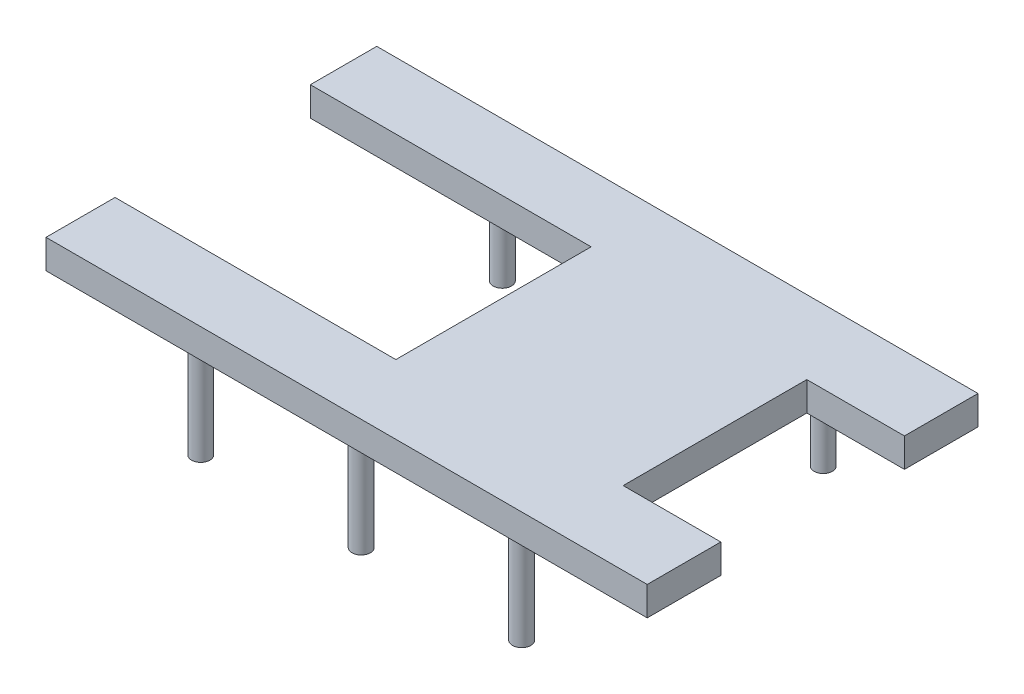
ISO-10303-21;
HEADER;
FILE_DESCRIPTION(('STEP AP214'),'2;1');
FILE_NAME('part.step','',(''),(''),'','','');
FILE_SCHEMA(('AUTOMOTIVE_DESIGN { 1 0 10303 214 1 1 1 1 }'));
ENDSEC;
DATA;
#1=APPLICATION_CONTEXT('core data for automotive mechanical design processes');
#2=APPLICATION_PROTOCOL_DEFINITION('international standard','automotive_design',2000,#1);
#3=PRODUCT_CONTEXT('',#1,'mechanical');
#4=PRODUCT('Part','Part','',(#3));
#5=PRODUCT_RELATED_PRODUCT_CATEGORY('part','',(#4));
#6=PRODUCT_DEFINITION_FORMATION('','',#4);
#7=PRODUCT_DEFINITION_CONTEXT('part definition',#1,'design');
#8=PRODUCT_DEFINITION('design','',#6,#7);
#9=PRODUCT_DEFINITION_SHAPE('','',#8);
#10=(LENGTH_UNIT() NAMED_UNIT(*) SI_UNIT(.MILLI.,.METRE.));
#11=(NAMED_UNIT(*) PLANE_ANGLE_UNIT() SI_UNIT($,.RADIAN.));
#12=(NAMED_UNIT(*) SI_UNIT($,.STERADIAN.) SOLID_ANGLE_UNIT());
#13=UNCERTAINTY_MEASURE_WITH_UNIT(LENGTH_MEASURE(1.E-05),#10,'distance_accuracy_value','');
#14=(GEOMETRIC_REPRESENTATION_CONTEXT(3) GLOBAL_UNCERTAINTY_ASSIGNED_CONTEXT((#13)) GLOBAL_UNIT_ASSIGNED_CONTEXT((#10,
#11,#12)) REPRESENTATION_CONTEXT('',''));
#15=CARTESIAN_POINT('',(0.,0.,0.));
#16=DIRECTION('',(0.,0.,1.));
#17=DIRECTION('',(1.,0.,0.));
#18=AXIS2_PLACEMENT_3D('',#15,#16,#17);
#19=CARTESIAN_POINT('',(0.,3.,0.));
#20=DIRECTION('',(0.,1.,0.));
#21=DIRECTION('',(0.,0.,1.));
#22=AXIS2_PLACEMENT_3D('',#19,#20,#21);
#23=PLANE('',#22);
#24=DIRECTION('',(-1.,0.,0.));
#25=VECTOR('',#24,1.);
#26=CARTESIAN_POINT('',(0.,3.,-9.49999999999998));
#27=LINE('',#26,#25);
#28=CARTESIAN_POINT('',(31.65,3.,-9.5));
#29=VERTEX_POINT('',#28);
#30=CARTESIAN_POINT('',(21.55,3.,-9.5));
#31=VERTEX_POINT('',#30);
#32=EDGE_CURVE('E201',#29,#31,#27,.T.);
#33=ORIENTED_EDGE('',*,*,#32,.F.);
#34=DIRECTION('',(0.,0.,1.));
#35=VECTOR('',#34,1.);
#36=CARTESIAN_POINT('',(31.65,3.,-9.5));
#37=LINE('',#36,#35);
#38=CARTESIAN_POINT('',(31.65,3.,-17.11));
#39=VERTEX_POINT('',#38);
#40=EDGE_CURVE('E193',#39,#29,#37,.T.);
#41=ORIENTED_EDGE('',*,*,#40,.F.);
#42=DIRECTION('',(1.,0.,0.));
#43=VECTOR('',#42,1.);
#44=CARTESIAN_POINT('',(31.65,3.,-17.11));
#45=LINE('',#44,#43);
#46=CARTESIAN_POINT('',(-30.55,3.00000000000002,-17.11));
#47=VERTEX_POINT('',#46);
#48=EDGE_CURVE('E163',#47,#39,#45,.T.);
#49=ORIENTED_EDGE('',*,*,#48,.F.);
#50=DIRECTION('',(0.,0.,-1.));
#51=VECTOR('',#50,1.);
#52=CARTESIAN_POINT('',(-30.55,3.,-13.9));
#53=LINE('',#52,#51);
#54=CARTESIAN_POINT('',(-30.55,3.,-10.2372755827815));
#55=VERTEX_POINT('',#54);
#56=EDGE_CURVE('E189',#55,#47,#53,.T.);
#57=ORIENTED_EDGE('',*,*,#56,.F.);
#58=DIRECTION('',(-1.,0.,0.));
#59=VECTOR('',#58,1.);
#60=CARTESIAN_POINT('',(0.,3.,-10.2372755827815));
#61=LINE('',#60,#59);
#62=CARTESIAN_POINT('',(-1.50000000000001,3.,-10.2372755827815));
#63=VERTEX_POINT('',#62);
#64=EDGE_CURVE('E219',#63,#55,#61,.T.);
#65=ORIENTED_EDGE('',*,*,#64,.F.);
#66=DIRECTION('',(0.,0.,1.));
#67=VECTOR('',#66,1.);
#68=CARTESIAN_POINT('',(-1.50000000000001,3.,0.));
#69=LINE('',#68,#67);
#70=CARTESIAN_POINT('',(-1.50000000000001,3.,9.9664839635949));
#71=VERTEX_POINT('',#70);
#72=EDGE_CURVE('E48',#63,#71,#69,.T.);
#73=ORIENTED_EDGE('',*,*,#72,.T.);
#74=DIRECTION('',(-1.,0.,0.));
#75=VECTOR('',#74,1.);
#76=CARTESIAN_POINT('',(0.,3.,9.9664839635949));
#77=LINE('',#76,#75);
#78=CARTESIAN_POINT('',(-30.55,3.,9.9664839635949));
#79=VERTEX_POINT('',#78);
#80=EDGE_CURVE('E223',#71,#79,#77,.T.);
#81=ORIENTED_EDGE('',*,*,#80,.T.);
#82=DIRECTION('',(0.,0.,-1.));
#83=VECTOR('',#82,1.);
#84=CARTESIAN_POINT('',(-30.55,3.,9.9664839635949));
#85=LINE('',#84,#83);
#86=CARTESIAN_POINT('',(-30.55,3.,17.11));
#87=VERTEX_POINT('',#86);
#88=EDGE_CURVE('E177',#87,#79,#85,.T.);
#89=ORIENTED_EDGE('',*,*,#88,.F.);
#90=DIRECTION('',(-1.,0.,0.));
#91=VECTOR('',#90,1.);
#92=CARTESIAN_POINT('',(-30.55,3.,17.11));
#93=LINE('',#92,#91);
#94=CARTESIAN_POINT('',(31.65,3.,17.11));
#95=VERTEX_POINT('',#94);
#96=EDGE_CURVE('E148',#95,#87,#93,.T.);
#97=ORIENTED_EDGE('',*,*,#96,.F.);
#98=DIRECTION('',(0.,0.,1.));
#99=VECTOR('',#98,1.);
#100=CARTESIAN_POINT('',(31.65,3.,9.5));
#101=LINE('',#100,#99);
#102=CARTESIAN_POINT('',(31.65,3.,9.5));
#103=VERTEX_POINT('',#102);
#104=EDGE_CURVE('E139',#103,#95,#101,.T.);
#105=ORIENTED_EDGE('',*,*,#104,.F.);
#106=DIRECTION('',(-1.,0.,0.));
#107=VECTOR('',#106,1.);
#108=CARTESIAN_POINT('',(0.,3.,9.50000000000001));
#109=LINE('',#108,#107);
#110=CARTESIAN_POINT('',(21.55,3.,9.5));
#111=VERTEX_POINT('',#110);
#112=EDGE_CURVE('E207',#103,#111,#109,.T.);
#113=ORIENTED_EDGE('',*,*,#112,.T.);
#114=DIRECTION('',(0.,0.,1.));
#115=VECTOR('',#114,1.);
#116=CARTESIAN_POINT('',(21.55,3.,0.));
#117=LINE('',#116,#115);
#118=EDGE_CURVE('E204',#31,#111,#117,.T.);
#119=ORIENTED_EDGE('',*,*,#118,.F.);
#120=EDGE_LOOP('',(#33,#41,#49,#57,#65,#73,#81,#89,#97,#105,#113,#119));
#121=FACE_BOUND('',#120,.T.);
#122=ADVANCED_FACE('F33',(#121),#23,.T.);
#123=CARTESIAN_POINT('',(0.,0.,0.));
#124=DIRECTION('',(0.,1.,0.));
#125=DIRECTION('',(0.,0.,1.));
#126=AXIS2_PLACEMENT_3D('',#123,#124,#125);
#127=PLANE('',#126);
#128=CARTESIAN_POINT('',(17.15,0.,-15.6));
#129=DIRECTION('',(0.,1.,0.));
#130=DIRECTION('',(0.,0.,1.));
#131=AXIS2_PLACEMENT_3D('',#128,#129,#130);
#132=CIRCLE('',#131,0.950000000000001);
#133=CARTESIAN_POINT('',(17.15,0.,-14.65));
#134=VERTEX_POINT('',#133);
#135=EDGE_CURVE('E11',#134,#134,#132,.F.);
#136=ORIENTED_EDGE('',*,*,#135,.F.);
#137=EDGE_LOOP('',(#136));
#138=FACE_BOUND('',#137,.T.);
#139=CARTESIAN_POINT('',(17.15,0.,15.6));
#140=DIRECTION('',(0.,1.,0.));
#141=DIRECTION('',(0.,0.,1.));
#142=AXIS2_PLACEMENT_3D('',#139,#140,#141);
#143=CIRCLE('',#142,0.950000000000001);
#144=CARTESIAN_POINT('',(17.15,0.,16.55));
#145=VERTEX_POINT('',#144);
#146=EDGE_CURVE('E41',#145,#145,#143,.F.);
#147=ORIENTED_EDGE('',*,*,#146,.F.);
#148=EDGE_LOOP('',(#147));
#149=FACE_BOUND('',#148,.T.);
#150=CARTESIAN_POINT('',(0.549999999999998,0.,15.6));
#151=DIRECTION('',(0.,1.,0.));
#152=DIRECTION('',(0.,0.,1.));
#153=AXIS2_PLACEMENT_3D('',#150,#151,#152);
#154=CIRCLE('',#153,0.95);
#155=CARTESIAN_POINT('',(0.549999999999998,0.,16.55));
#156=VERTEX_POINT('',#155);
#157=EDGE_CURVE('E241',#156,#156,#154,.F.);
#158=ORIENTED_EDGE('',*,*,#157,.F.);
#159=EDGE_LOOP('',(#158));
#160=FACE_BOUND('',#159,.T.);
#161=CARTESIAN_POINT('',(0.549999999999998,0.,-15.6));
#162=DIRECTION('',(0.,1.,0.));
#163=DIRECTION('',(0.,0.,1.));
#164=AXIS2_PLACEMENT_3D('',#161,#162,#163);
#165=CIRCLE('',#164,0.95);
#166=CARTESIAN_POINT('',(0.549999999999998,0.,-14.65));
#167=VERTEX_POINT('',#166);
#168=EDGE_CURVE('E238',#167,#167,#165,.F.);
#169=ORIENTED_EDGE('',*,*,#168,.F.);
#170=EDGE_LOOP('',(#169));
#171=FACE_BOUND('',#170,.T.);
#172=CARTESIAN_POINT('',(-16.05,0.,-15.6));
#173=DIRECTION('',(0.,1.,0.));
#174=DIRECTION('',(0.,0.,1.));
#175=AXIS2_PLACEMENT_3D('',#172,#173,#174);
#176=CIRCLE('',#175,0.949999999999999);
#177=CARTESIAN_POINT('',(-16.05,0.,-14.65));
#178=VERTEX_POINT('',#177);
#179=EDGE_CURVE('E235',#178,#178,#176,.F.);
#180=ORIENTED_EDGE('',*,*,#179,.F.);
#181=EDGE_LOOP('',(#180));
#182=FACE_BOUND('',#181,.T.);
#183=CARTESIAN_POINT('',(-16.05,0.,15.6));
#184=DIRECTION('',(0.,1.,0.));
#185=DIRECTION('',(0.,0.,1.));
#186=AXIS2_PLACEMENT_3D('',#183,#184,#185);
#187=CIRCLE('',#186,0.950000000000001);
#188=CARTESIAN_POINT('',(-16.05,0.,16.55));
#189=VERTEX_POINT('',#188);
#190=EDGE_CURVE('E232',#189,#189,#187,.F.);
#191=ORIENTED_EDGE('',*,*,#190,.F.);
#192=EDGE_LOOP('',(#191));
#193=FACE_BOUND('',#192,.T.);
#194=DIRECTION('',(0.,0.,1.));
#195=VECTOR('',#194,1.);
#196=CARTESIAN_POINT('',(-30.55,0.,-13.9));
#197=LINE('',#196,#195);
#198=CARTESIAN_POINT('',(-30.55,0.,-17.11));
#199=VERTEX_POINT('',#198);
#200=CARTESIAN_POINT('',(-30.55,0.,-10.2372755827815));
#201=VERTEX_POINT('',#200);
#202=EDGE_CURVE('E183',#199,#201,#197,.T.);
#203=ORIENTED_EDGE('',*,*,#202,.F.);
#204=DIRECTION('',(-1.,0.,0.));
#205=VECTOR('',#204,1.);
#206=CARTESIAN_POINT('',(31.65,0.,-17.11));
#207=LINE('',#206,#205);
#208=CARTESIAN_POINT('',(31.65,0.,-17.11));
#209=VERTEX_POINT('',#208);
#210=EDGE_CURVE('E169',#209,#199,#207,.T.);
#211=ORIENTED_EDGE('',*,*,#210,.F.);
#212=DIRECTION('',(0.,0.,-1.));
#213=VECTOR('',#212,1.);
#214=CARTESIAN_POINT('',(31.65,0.,-9.5));
#215=LINE('',#214,#213);
#216=CARTESIAN_POINT('',(31.65,0.,-9.5));
#217=VERTEX_POINT('',#216);
#218=EDGE_CURVE('E199',#217,#209,#215,.T.);
#219=ORIENTED_EDGE('',*,*,#218,.F.);
#220=DIRECTION('',(-1.,0.,0.));
#221=VECTOR('',#220,1.);
#222=CARTESIAN_POINT('',(0.,0.,-9.49999999999998));
#223=LINE('',#222,#221);
#224=CARTESIAN_POINT('',(21.55,0.,-9.5));
#225=VERTEX_POINT('',#224);
#226=EDGE_CURVE('E215',#217,#225,#223,.T.);
#227=ORIENTED_EDGE('',*,*,#226,.T.);
#228=DIRECTION('',(0.,0.,1.));
#229=VECTOR('',#228,1.);
#230=CARTESIAN_POINT('',(21.55,0.,0.));
#231=LINE('',#230,#229);
#232=CARTESIAN_POINT('',(21.55,0.,9.5));
#233=VERTEX_POINT('',#232);
#234=EDGE_CURVE('E69',#225,#233,#231,.T.);
#235=ORIENTED_EDGE('',*,*,#234,.T.);
#236=DIRECTION('',(-1.,0.,0.));
#237=VECTOR('',#236,1.);
#238=CARTESIAN_POINT('',(0.,0.,9.50000000000001));
#239=LINE('',#238,#237);
#240=CARTESIAN_POINT('',(31.65,0.,9.5));
#241=VERTEX_POINT('',#240);
#242=EDGE_CURVE('E77',#241,#233,#239,.T.);
#243=ORIENTED_EDGE('',*,*,#242,.F.);
#244=DIRECTION('',(0.,0.,-1.));
#245=VECTOR('',#244,1.);
#246=CARTESIAN_POINT('',(31.65,0.,9.5));
#247=LINE('',#246,#245);
#248=CARTESIAN_POINT('',(31.65,0.,17.11));
#249=VERTEX_POINT('',#248);
#250=EDGE_CURVE('E131',#249,#241,#247,.T.);
#251=ORIENTED_EDGE('',*,*,#250,.F.);
#252=DIRECTION('',(1.,0.,0.));
#253=VECTOR('',#252,1.);
#254=CARTESIAN_POINT('',(-30.55,0.,17.11));
#255=LINE('',#254,#253);
#256=CARTESIAN_POINT('',(-30.55,0.,17.11));
#257=VERTEX_POINT('',#256);
#258=EDGE_CURVE('E135',#257,#249,#255,.T.);
#259=ORIENTED_EDGE('',*,*,#258,.F.);
#260=DIRECTION('',(0.,0.,1.));
#261=VECTOR('',#260,1.);
#262=CARTESIAN_POINT('',(-30.55,0.,9.9664839635949));
#263=LINE('',#262,#261);
#264=CARTESIAN_POINT('',(-30.55,0.,9.9664839635949));
#265=VERTEX_POINT('',#264);
#266=EDGE_CURVE('E175',#265,#257,#263,.T.);
#267=ORIENTED_EDGE('',*,*,#266,.F.);
#268=DIRECTION('',(-1.,0.,0.));
#269=VECTOR('',#268,1.);
#270=CARTESIAN_POINT('',(0.,0.,9.9664839635949));
#271=LINE('',#270,#269);
#272=CARTESIAN_POINT('',(-1.50000000000001,0.,9.9664839635949));
#273=VERTEX_POINT('',#272);
#274=EDGE_CURVE('E221',#273,#265,#271,.T.);
#275=ORIENTED_EDGE('',*,*,#274,.F.);
#276=DIRECTION('',(0.,0.,1.));
#277=VECTOR('',#276,1.);
#278=CARTESIAN_POINT('',(-1.50000000000001,0.,0.));
#279=LINE('',#278,#277);
#280=CARTESIAN_POINT('',(-1.50000000000001,0.,-10.2372755827815));
#281=VERTEX_POINT('',#280);
#282=EDGE_CURVE('E226',#281,#273,#279,.T.);
#283=ORIENTED_EDGE('',*,*,#282,.F.);
#284=DIRECTION('',(-1.,0.,0.));
#285=VECTOR('',#284,1.);
#286=CARTESIAN_POINT('',(0.,0.,-10.2372755827815));
#287=LINE('',#286,#285);
#288=EDGE_CURVE('E218',#281,#201,#287,.T.);
#289=ORIENTED_EDGE('',*,*,#288,.T.);
#290=EDGE_LOOP('',(#203,#211,#219,#227,#235,#243,#251,#259,#267,#275,#283,#289));
#291=FACE_BOUND('',#290,.T.);
#292=ADVANCED_FACE('F35',(#138,#149,#160,#171,#182,#193,#291),#127,.F.);
#293=CARTESIAN_POINT('',(0.,3.,9.9664839635949));
#294=DIRECTION('',(0.,0.,1.));
#295=DIRECTION('',(1.,0.,0.));
#296=AXIS2_PLACEMENT_3D('',#293,#294,#295);
#297=PLANE('',#296);
#298=ORIENTED_EDGE('',*,*,#274,.T.);
#299=DIRECTION('',(0.,-1.,0.));
#300=VECTOR('',#299,1.);
#301=CARTESIAN_POINT('',(-30.55,0.,9.9664839635949));
#302=LINE('',#301,#300);
#303=EDGE_CURVE('E180',#79,#265,#302,.T.);
#304=ORIENTED_EDGE('',*,*,#303,.F.);
#305=ORIENTED_EDGE('',*,*,#80,.F.);
#306=DIRECTION('',(0.,-1.,0.));
#307=VECTOR('',#306,1.);
#308=CARTESIAN_POINT('',(-1.50000000000001,3.,9.9664839635949));
#309=LINE('',#308,#307);
#310=EDGE_CURVE('E54',#71,#273,#309,.T.);
#311=ORIENTED_EDGE('',*,*,#310,.T.);
#312=EDGE_LOOP('',(#298,#304,#305,#311));
#313=FACE_BOUND('',#312,.T.);
#314=ADVANCED_FACE('F250',(#313),#297,.F.);
#315=CARTESIAN_POINT('',(-1.50000000000001,3.,0.));
#316=DIRECTION('',(1.,0.,0.));
#317=DIRECTION('',(0.,0.,-1.));
#318=AXIS2_PLACEMENT_3D('',#315,#316,#317);
#319=PLANE('',#318);
#320=ORIENTED_EDGE('',*,*,#282,.T.);
#321=ORIENTED_EDGE('',*,*,#310,.F.);
#322=ORIENTED_EDGE('',*,*,#72,.F.);
#323=DIRECTION('',(0.,-1.,0.));
#324=VECTOR('',#323,1.);
#325=CARTESIAN_POINT('',(-1.50000000000001,3.,-10.2372755827815));
#326=LINE('',#325,#324);
#327=EDGE_CURVE('E61',#63,#281,#326,.T.);
#328=ORIENTED_EDGE('',*,*,#327,.T.);
#329=EDGE_LOOP('',(#320,#321,#322,#328));
#330=FACE_BOUND('',#329,.T.);
#331=ADVANCED_FACE('F284',(#330),#319,.F.);
#332=CARTESIAN_POINT('',(0.,3.,-10.2372755827815));
#333=DIRECTION('',(0.,0.,1.));
#334=DIRECTION('',(1.,0.,0.));
#335=AXIS2_PLACEMENT_3D('',#332,#333,#334);
#336=PLANE('',#335);
#337=ORIENTED_EDGE('',*,*,#288,.F.);
#338=ORIENTED_EDGE('',*,*,#327,.F.);
#339=ORIENTED_EDGE('',*,*,#64,.T.);
#340=DIRECTION('',(0.,1.,0.));
#341=VECTOR('',#340,1.);
#342=CARTESIAN_POINT('',(-30.55,0.,-10.2372755827815));
#343=LINE('',#342,#341);
#344=EDGE_CURVE('E186',#201,#55,#343,.T.);
#345=ORIENTED_EDGE('',*,*,#344,.F.);
#346=EDGE_LOOP('',(#337,#338,#339,#345));
#347=FACE_BOUND('',#346,.T.);
#348=ADVANCED_FACE('F280',(#347),#336,.T.);
#349=CARTESIAN_POINT('',(21.55,-7.,0.));
#350=DIRECTION('',(-1.,0.,0.));
#351=DIRECTION('',(0.,0.,1.));
#352=AXIS2_PLACEMENT_3D('',#349,#350,#351);
#353=PLANE('',#352);
#354=DIRECTION('',(0.,1.,0.));
#355=VECTOR('',#354,1.);
#356=CARTESIAN_POINT('',(21.55,-7.,-9.5));
#357=LINE('',#356,#355);
#358=EDGE_CURVE('E210',#225,#31,#357,.T.);
#359=ORIENTED_EDGE('',*,*,#358,.T.);
#360=ORIENTED_EDGE('',*,*,#118,.T.);
#361=DIRECTION('',(0.,1.,0.));
#362=VECTOR('',#361,1.);
#363=CARTESIAN_POINT('',(21.55,-7.,9.5));
#364=LINE('',#363,#362);
#365=EDGE_CURVE('E211',#233,#111,#364,.T.);
#366=ORIENTED_EDGE('',*,*,#365,.F.);
#367=ORIENTED_EDGE('',*,*,#234,.F.);
#368=EDGE_LOOP('',(#359,#360,#366,#367));
#369=FACE_BOUND('',#368,.T.);
#370=ADVANCED_FACE('F283',(#369),#353,.F.);
#371=CARTESIAN_POINT('',(0.,-7.,-9.49999999999998));
#372=DIRECTION('',(0.,0.,-1.));
#373=DIRECTION('',(-1.,0.,0.));
#374=AXIS2_PLACEMENT_3D('',#371,#372,#373);
#375=PLANE('',#374);
#376=ORIENTED_EDGE('',*,*,#226,.F.);
#377=DIRECTION('',(0.,-1.,0.));
#378=VECTOR('',#377,1.);
#379=CARTESIAN_POINT('',(31.65,3.,-9.5));
#380=LINE('',#379,#378);
#381=EDGE_CURVE('E196',#29,#217,#380,.T.);
#382=ORIENTED_EDGE('',*,*,#381,.F.);
#383=ORIENTED_EDGE('',*,*,#32,.T.);
#384=ORIENTED_EDGE('',*,*,#358,.F.);
#385=EDGE_LOOP('',(#376,#382,#383,#384));
#386=FACE_BOUND('',#385,.T.);
#387=ADVANCED_FACE('F291',(#386),#375,.F.);
#388=CARTESIAN_POINT('',(0.,-7.,9.50000000000001));
#389=DIRECTION('',(0.,0.,-1.));
#390=DIRECTION('',(-1.,0.,0.));
#391=AXIS2_PLACEMENT_3D('',#388,#389,#390);
#392=PLANE('',#391);
#393=ORIENTED_EDGE('',*,*,#242,.T.);
#394=ORIENTED_EDGE('',*,*,#365,.T.);
#395=ORIENTED_EDGE('',*,*,#112,.F.);
#396=DIRECTION('',(0.,1.,0.));
#397=VECTOR('',#396,1.);
#398=CARTESIAN_POINT('',(31.65,3.,9.5));
#399=LINE('',#398,#397);
#400=EDGE_CURVE('E138',#241,#103,#399,.T.);
#401=ORIENTED_EDGE('',*,*,#400,.F.);
#402=EDGE_LOOP('',(#393,#394,#395,#401));
#403=FACE_BOUND('',#402,.T.);
#404=ADVANCED_FACE('F294',(#403),#392,.T.);
#405=CARTESIAN_POINT('',(31.65,0.,0.));
#406=DIRECTION('',(-1.,0.,0.));
#407=DIRECTION('',(0.,0.,1.));
#408=AXIS2_PLACEMENT_3D('',#405,#406,#407);
#409=PLANE('',#408);
#410=ORIENTED_EDGE('',*,*,#40,.T.);
#411=ORIENTED_EDGE('',*,*,#381,.T.);
#412=ORIENTED_EDGE('',*,*,#218,.T.);
#413=DIRECTION('',(0.,-1.,0.));
#414=VECTOR('',#413,1.);
#415=CARTESIAN_POINT('',(31.65,3.,-17.11));
#416=LINE('',#415,#414);
#417=EDGE_CURVE('E166',#39,#209,#416,.T.);
#418=ORIENTED_EDGE('',*,*,#417,.F.);
#419=EDGE_LOOP('',(#410,#411,#412,#418));
#420=FACE_BOUND('',#419,.T.);
#421=ADVANCED_FACE('F300',(#420),#409,.F.);
#422=CARTESIAN_POINT('',(31.65,0.,0.));
#423=DIRECTION('',(1.,0.,0.));
#424=DIRECTION('',(0.,0.,-1.));
#425=AXIS2_PLACEMENT_3D('',#422,#423,#424);
#426=PLANE('',#425);
#427=ORIENTED_EDGE('',*,*,#104,.T.);
#428=DIRECTION('',(0.,1.,0.));
#429=VECTOR('',#428,1.);
#430=CARTESIAN_POINT('',(31.65,0.,17.11));
#431=LINE('',#430,#429);
#432=EDGE_CURVE('E142',#249,#95,#431,.T.);
#433=ORIENTED_EDGE('',*,*,#432,.F.);
#434=ORIENTED_EDGE('',*,*,#250,.T.);
#435=ORIENTED_EDGE('',*,*,#400,.T.);
#436=EDGE_LOOP('',(#427,#433,#434,#435));
#437=FACE_BOUND('',#436,.T.);
#438=ADVANCED_FACE('F143',(#437),#426,.T.);
#439=CARTESIAN_POINT('',(-30.55,0.,0.));
#440=DIRECTION('',(1.,0.,0.));
#441=DIRECTION('',(0.,0.,-1.));
#442=AXIS2_PLACEMENT_3D('',#439,#440,#441);
#443=PLANE('',#442);
#444=ORIENTED_EDGE('',*,*,#56,.T.);
#445=DIRECTION('',(0.,1.,0.));
#446=VECTOR('',#445,1.);
#447=CARTESIAN_POINT('',(-30.55,3.00000000000002,-17.11));
#448=LINE('',#447,#446);
#449=EDGE_CURVE('E172',#199,#47,#448,.T.);
#450=ORIENTED_EDGE('',*,*,#449,.F.);
#451=ORIENTED_EDGE('',*,*,#202,.T.);
#452=ORIENTED_EDGE('',*,*,#344,.T.);
#453=EDGE_LOOP('',(#444,#450,#451,#452));
#454=FACE_BOUND('',#453,.T.);
#455=ADVANCED_FACE('F306',(#454),#443,.F.);
#456=CARTESIAN_POINT('',(-30.55,0.,0.));
#457=DIRECTION('',(-1.,0.,0.));
#458=DIRECTION('',(0.,0.,1.));
#459=AXIS2_PLACEMENT_3D('',#456,#457,#458);
#460=PLANE('',#459);
#461=ORIENTED_EDGE('',*,*,#266,.T.);
#462=DIRECTION('',(0.,-1.,0.));
#463=VECTOR('',#462,1.);
#464=CARTESIAN_POINT('',(-30.55,0.,17.11));
#465=LINE('',#464,#463);
#466=EDGE_CURVE('E153',#87,#257,#465,.T.);
#467=ORIENTED_EDGE('',*,*,#466,.F.);
#468=ORIENTED_EDGE('',*,*,#88,.T.);
#469=ORIENTED_EDGE('',*,*,#303,.T.);
#470=EDGE_LOOP('',(#461,#467,#468,#469));
#471=FACE_BOUND('',#470,.T.);
#472=ADVANCED_FACE('F309',(#471),#460,.T.);
#473=CARTESIAN_POINT('',(0.,0.,-17.11));
#474=DIRECTION('',(0.,0.,1.));
#475=DIRECTION('',(1.,0.,0.));
#476=AXIS2_PLACEMENT_3D('',#473,#474,#475);
#477=PLANE('',#476);
#478=ORIENTED_EDGE('',*,*,#48,.T.);
#479=ORIENTED_EDGE('',*,*,#417,.T.);
#480=ORIENTED_EDGE('',*,*,#210,.T.);
#481=ORIENTED_EDGE('',*,*,#449,.T.);
#482=EDGE_LOOP('',(#478,#479,#480,#481));
#483=FACE_BOUND('',#482,.T.);
#484=ADVANCED_FACE('F272',(#483),#477,.F.);
#485=CARTESIAN_POINT('',(0.,0.,17.11));
#486=DIRECTION('',(0.,0.,1.));
#487=DIRECTION('',(1.,0.,0.));
#488=AXIS2_PLACEMENT_3D('',#485,#486,#487);
#489=PLANE('',#488);
#490=ORIENTED_EDGE('',*,*,#258,.T.);
#491=ORIENTED_EDGE('',*,*,#432,.T.);
#492=ORIENTED_EDGE('',*,*,#96,.T.);
#493=ORIENTED_EDGE('',*,*,#466,.T.);
#494=EDGE_LOOP('',(#490,#491,#492,#493));
#495=FACE_BOUND('',#494,.T.);
#496=ADVANCED_FACE('F151',(#495),#489,.T.);
#497=CARTESIAN_POINT('',(-16.05,-10.,15.6));
#498=DIRECTION('',(0.,1.,0.));
#499=DIRECTION('',(0.,0.,1.));
#500=AXIS2_PLACEMENT_3D('',#497,#498,#499);
#501=CYLINDRICAL_SURFACE('',#500,0.950000000000001);
#502=CARTESIAN_POINT('',(-16.05,-10.,15.6));
#503=DIRECTION('',(0.,-1.,0.));
#504=DIRECTION('',(0.,0.,-1.));
#505=AXIS2_PLACEMENT_3D('',#502,#503,#504);
#506=CIRCLE('',#505,0.950000000000001);
#507=CARTESIAN_POINT('',(-16.05,-10.,14.65));
#508=VERTEX_POINT('',#507);
#509=EDGE_CURVE('E154',#508,#508,#506,.T.);
#510=ORIENTED_EDGE('',*,*,#509,.F.);
#511=EDGE_LOOP('',(#510));
#512=FACE_BOUND('',#511,.T.);
#513=ORIENTED_EDGE('',*,*,#190,.T.);
#514=EDGE_LOOP('',(#513));
#515=FACE_BOUND('',#514,.T.);
#516=ADVANCED_FACE('F260',(#512,#515),#501,.T.);
#517=CARTESIAN_POINT('',(-16.05,-10.,15.6));
#518=DIRECTION('',(0.,-1.,0.));
#519=DIRECTION('',(0.,0.,-1.));
#520=AXIS2_PLACEMENT_3D('',#517,#518,#519);
#521=PLANE('',#520);
#522=ORIENTED_EDGE('',*,*,#509,.T.);
#523=EDGE_LOOP('',(#522));
#524=FACE_BOUND('',#523,.T.);
#525=ADVANCED_FACE('F262',(#524),#521,.T.);
#526=CARTESIAN_POINT('',(-16.05,-10.,-15.6));
#527=DIRECTION('',(0.,1.,0.));
#528=DIRECTION('',(0.,0.,1.));
#529=AXIS2_PLACEMENT_3D('',#526,#527,#528);
#530=CYLINDRICAL_SURFACE('',#529,0.949999999999999);
#531=CARTESIAN_POINT('',(-16.05,-10.,-15.6));
#532=DIRECTION('',(0.,-1.,0.));
#533=DIRECTION('',(0.,0.,-1.));
#534=AXIS2_PLACEMENT_3D('',#531,#532,#533);
#535=CIRCLE('',#534,0.949999999999999);
#536=CARTESIAN_POINT('',(-16.05,-10.,-16.55));
#537=VERTEX_POINT('',#536);
#538=EDGE_CURVE('E157',#537,#537,#535,.T.);
#539=ORIENTED_EDGE('',*,*,#538,.F.);
#540=EDGE_LOOP('',(#539));
#541=FACE_BOUND('',#540,.T.);
#542=ORIENTED_EDGE('',*,*,#179,.T.);
#543=EDGE_LOOP('',(#542));
#544=FACE_BOUND('',#543,.T.);
#545=ADVANCED_FACE('F269',(#541,#544),#530,.T.);
#546=CARTESIAN_POINT('',(-16.05,-10.,-15.6));
#547=DIRECTION('',(0.,-1.,0.));
#548=DIRECTION('',(0.,0.,-1.));
#549=AXIS2_PLACEMENT_3D('',#546,#547,#548);
#550=PLANE('',#549);
#551=ORIENTED_EDGE('',*,*,#538,.T.);
#552=EDGE_LOOP('',(#551));
#553=FACE_BOUND('',#552,.T.);
#554=ADVANCED_FACE('F369',(#553),#550,.T.);
#555=CARTESIAN_POINT('',(0.549999999999998,-10.,-15.6));
#556=DIRECTION('',(0.,1.,0.));
#557=DIRECTION('',(0.,0.,1.));
#558=AXIS2_PLACEMENT_3D('',#555,#556,#557);
#559=CYLINDRICAL_SURFACE('',#558,0.95);
#560=CARTESIAN_POINT('',(0.549999999999998,-10.,-15.6));
#561=DIRECTION('',(0.,-1.,0.));
#562=DIRECTION('',(0.,0.,-1.));
#563=AXIS2_PLACEMENT_3D('',#560,#561,#562);
#564=CIRCLE('',#563,0.95);
#565=CARTESIAN_POINT('',(0.549999999999998,-10.,-16.55));
#566=VERTEX_POINT('',#565);
#567=EDGE_CURVE('E473',#566,#566,#564,.T.);
#568=ORIENTED_EDGE('',*,*,#567,.F.);
#569=EDGE_LOOP('',(#568));
#570=FACE_BOUND('',#569,.T.);
#571=ORIENTED_EDGE('',*,*,#168,.T.);
#572=EDGE_LOOP('',(#571));
#573=FACE_BOUND('',#572,.T.);
#574=ADVANCED_FACE('F379',(#570,#573),#559,.T.);
#575=CARTESIAN_POINT('',(0.549999999999998,-10.,-15.6));
#576=DIRECTION('',(0.,-1.,0.));
#577=DIRECTION('',(0.,0.,-1.));
#578=AXIS2_PLACEMENT_3D('',#575,#576,#577);
#579=PLANE('',#578);
#580=ORIENTED_EDGE('',*,*,#567,.T.);
#581=EDGE_LOOP('',(#580));
#582=FACE_BOUND('',#581,.T.);
#583=ADVANCED_FACE('F389',(#582),#579,.T.);
#584=CARTESIAN_POINT('',(0.549999999999998,-10.,15.6));
#585=DIRECTION('',(0.,1.,0.));
#586=DIRECTION('',(0.,0.,1.));
#587=AXIS2_PLACEMENT_3D('',#584,#585,#586);
#588=CYLINDRICAL_SURFACE('',#587,0.95);
#589=CARTESIAN_POINT('',(0.549999999999998,-10.,15.6));
#590=DIRECTION('',(0.,-1.,0.));
#591=DIRECTION('',(0.,0.,-1.));
#592=AXIS2_PLACEMENT_3D('',#589,#590,#591);
#593=CIRCLE('',#592,0.95);
#594=CARTESIAN_POINT('',(0.549999999999998,-10.,14.65));
#595=VERTEX_POINT('',#594);
#596=EDGE_CURVE('E468',#595,#595,#593,.T.);
#597=ORIENTED_EDGE('',*,*,#596,.F.);
#598=EDGE_LOOP('',(#597));
#599=FACE_BOUND('',#598,.T.);
#600=ORIENTED_EDGE('',*,*,#157,.T.);
#601=EDGE_LOOP('',(#600));
#602=FACE_BOUND('',#601,.T.);
#603=ADVANCED_FACE('F399',(#599,#602),#588,.T.);
#604=CARTESIAN_POINT('',(0.549999999999998,-10.,15.6));
#605=DIRECTION('',(0.,-1.,0.));
#606=DIRECTION('',(0.,0.,-1.));
#607=AXIS2_PLACEMENT_3D('',#604,#605,#606);
#608=PLANE('',#607);
#609=ORIENTED_EDGE('',*,*,#596,.T.);
#610=EDGE_LOOP('',(#609));
#611=FACE_BOUND('',#610,.T.);
#612=ADVANCED_FACE('F409',(#611),#608,.T.);
#613=CARTESIAN_POINT('',(17.15,-10.,15.6));
#614=DIRECTION('',(0.,1.,0.));
#615=DIRECTION('',(0.,0.,1.));
#616=AXIS2_PLACEMENT_3D('',#613,#614,#615);
#617=CYLINDRICAL_SURFACE('',#616,0.950000000000001);
#618=CARTESIAN_POINT('',(17.15,-10.,15.6));
#619=DIRECTION('',(0.,-1.,0.));
#620=DIRECTION('',(0.,0.,-1.));
#621=AXIS2_PLACEMENT_3D('',#618,#619,#620);
#622=CIRCLE('',#621,0.950000000000001);
#623=CARTESIAN_POINT('',(17.15,-10.,14.65));
#624=VERTEX_POINT('',#623);
#625=EDGE_CURVE('E465',#624,#624,#622,.T.);
#626=ORIENTED_EDGE('',*,*,#625,.F.);
#627=EDGE_LOOP('',(#626));
#628=FACE_BOUND('',#627,.T.);
#629=ORIENTED_EDGE('',*,*,#146,.T.);
#630=EDGE_LOOP('',(#629));
#631=FACE_BOUND('',#630,.T.);
#632=ADVANCED_FACE('F246',(#628,#631),#617,.T.);
#633=CARTESIAN_POINT('',(17.15,-10.,15.6));
#634=DIRECTION('',(0.,-1.,0.));
#635=DIRECTION('',(0.,0.,-1.));
#636=AXIS2_PLACEMENT_3D('',#633,#634,#635);
#637=PLANE('',#636);
#638=ORIENTED_EDGE('',*,*,#625,.T.);
#639=EDGE_LOOP('',(#638));
#640=FACE_BOUND('',#639,.T.);
#641=ADVANCED_FACE('F428',(#640),#637,.T.);
#642=CARTESIAN_POINT('',(17.15,-10.,-15.6));
#643=DIRECTION('',(0.,1.,0.));
#644=DIRECTION('',(0.,0.,1.));
#645=AXIS2_PLACEMENT_3D('',#642,#643,#644);
#646=CYLINDRICAL_SURFACE('',#645,0.950000000000001);
#647=CARTESIAN_POINT('',(17.15,-10.,-15.6));
#648=DIRECTION('',(0.,-1.,0.));
#649=DIRECTION('',(0.,0.,-1.));
#650=AXIS2_PLACEMENT_3D('',#647,#648,#649);
#651=CIRCLE('',#650,0.950000000000001);
#652=CARTESIAN_POINT('',(17.15,-10.,-16.55));
#653=VERTEX_POINT('',#652);
#654=EDGE_CURVE('E464',#653,#653,#651,.T.);
#655=ORIENTED_EDGE('',*,*,#654,.F.);
#656=EDGE_LOOP('',(#655));
#657=FACE_BOUND('',#656,.T.);
#658=ORIENTED_EDGE('',*,*,#135,.T.);
#659=EDGE_LOOP('',(#658));
#660=FACE_BOUND('',#659,.T.);
#661=ADVANCED_FACE('F438',(#657,#660),#646,.T.);
#662=CARTESIAN_POINT('',(17.15,-10.,-15.6));
#663=DIRECTION('',(0.,-1.,0.));
#664=DIRECTION('',(0.,0.,-1.));
#665=AXIS2_PLACEMENT_3D('',#662,#663,#664);
#666=PLANE('',#665);
#667=ORIENTED_EDGE('',*,*,#654,.T.);
#668=EDGE_LOOP('',(#667));
#669=FACE_BOUND('',#668,.T.);
#670=ADVANCED_FACE('F448',(#669),#666,.T.);
#671=CLOSED_SHELL('',(#122,#292,#314,#331,#348,#370,#387,#404,#421,#438,#455,#472,#484,#496,
#516,#525,#545,#554,#574,#583,#603,#612,#632,#641,#661,#670));
#672=MANIFOLD_SOLID_BREP('B2',#671);
#673=ADVANCED_BREP_SHAPE_REPRESENTATION('',(#18,#672),#14);
#674=SHAPE_DEFINITION_REPRESENTATION(#9,#673);
ENDSEC;
END-ISO-10303-21;
